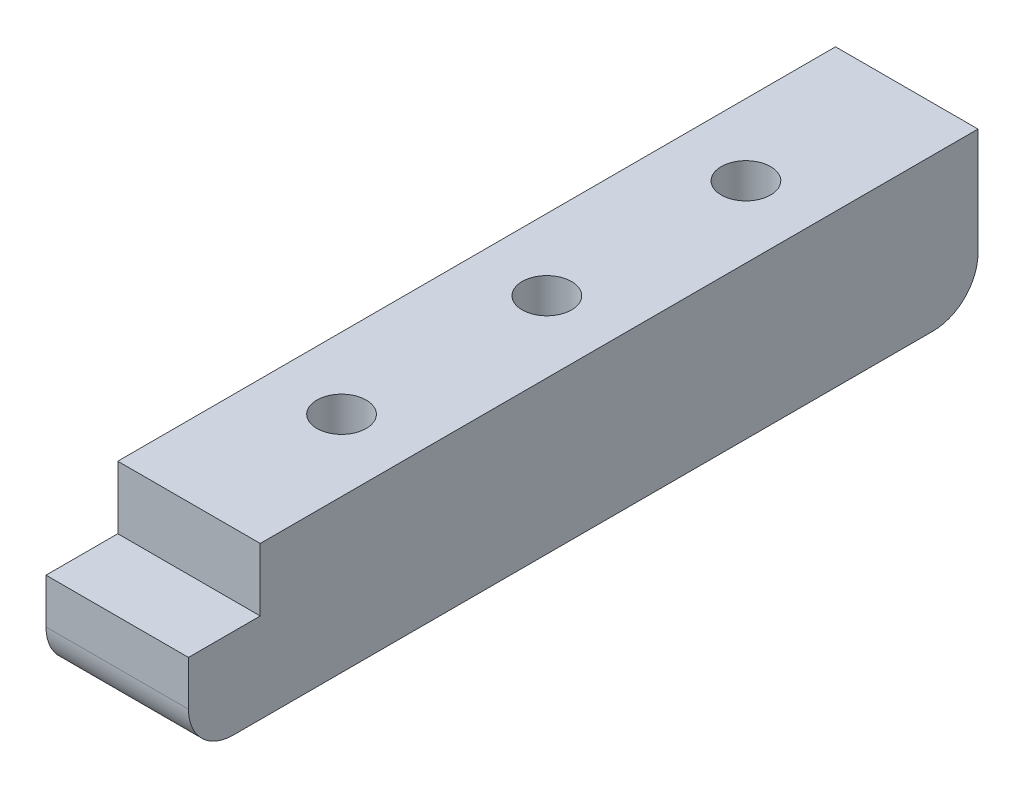
ISO-10303-21;
HEADER;
FILE_DESCRIPTION(('STEP AP214'),'2;1');
FILE_NAME('part.step','',(''),(''),'','','');
FILE_SCHEMA(('AUTOMOTIVE_DESIGN { 1 0 10303 214 1 1 1 1 }'));
ENDSEC;
DATA;
#1=APPLICATION_CONTEXT('core data for automotive mechanical design processes');
#2=APPLICATION_PROTOCOL_DEFINITION('international standard','automotive_design',2000,#1);
#3=PRODUCT_CONTEXT('',#1,'mechanical');
#4=PRODUCT('Part','Part','',(#3));
#5=PRODUCT_RELATED_PRODUCT_CATEGORY('part','',(#4));
#6=PRODUCT_DEFINITION_FORMATION('','',#4);
#7=PRODUCT_DEFINITION_CONTEXT('part definition',#1,'design');
#8=PRODUCT_DEFINITION('design','',#6,#7);
#9=PRODUCT_DEFINITION_SHAPE('','',#8);
#10=(LENGTH_UNIT() NAMED_UNIT(*) SI_UNIT(.MILLI.,.METRE.));
#11=(NAMED_UNIT(*) PLANE_ANGLE_UNIT() SI_UNIT($,.RADIAN.));
#12=(NAMED_UNIT(*) SI_UNIT($,.STERADIAN.) SOLID_ANGLE_UNIT());
#13=UNCERTAINTY_MEASURE_WITH_UNIT(LENGTH_MEASURE(1.E-05),#10,'distance_accuracy_value','');
#14=(GEOMETRIC_REPRESENTATION_CONTEXT(3) GLOBAL_UNCERTAINTY_ASSIGNED_CONTEXT((#13)) GLOBAL_UNIT_ASSIGNED_CONTEXT((#10,
#11,#12)) REPRESENTATION_CONTEXT('',''));
#15=CARTESIAN_POINT('',(0.,0.,0.));
#16=DIRECTION('',(0.,0.,1.));
#17=DIRECTION('',(1.,0.,0.));
#18=AXIS2_PLACEMENT_3D('',#15,#16,#17);
#19=CARTESIAN_POINT('',(7.94,-8.5,-63.));
#20=DIRECTION('',(0.,0.,1.));
#21=DIRECTION('',(1.,0.,0.));
#22=AXIS2_PLACEMENT_3D('',#19,#20,#21);
#23=PLANE('',#22);
#24=DIRECTION('',(0.,1.,0.));
#25=VECTOR('',#24,1.);
#26=CARTESIAN_POINT('',(7.94,-8.5,-63.));
#27=LINE('',#26,#25);
#28=CARTESIAN_POINT('',(7.94,-3.5,-63.));
#29=VERTEX_POINT('',#28);
#30=CARTESIAN_POINT('',(7.94,8.5,-63.));
#31=VERTEX_POINT('',#30);
#32=EDGE_CURVE('E102',#29,#31,#27,.T.);
#33=ORIENTED_EDGE('',*,*,#32,.F.);
#34=DIRECTION('',(-1.,0.,0.));
#35=VECTOR('',#34,1.);
#36=CARTESIAN_POINT('',(7.94,-3.5,-63.));
#37=LINE('',#36,#35);
#38=CARTESIAN_POINT('',(-7.94,-3.5,-63.));
#39=VERTEX_POINT('',#38);
#40=EDGE_CURVE('E11',#29,#39,#37,.T.);
#41=ORIENTED_EDGE('',*,*,#40,.T.);
#42=DIRECTION('',(0.,1.,0.));
#43=VECTOR('',#42,1.);
#44=CARTESIAN_POINT('',(-7.94,-8.5,-63.));
#45=LINE('',#44,#43);
#46=CARTESIAN_POINT('',(-7.94,8.5,-63.));
#47=VERTEX_POINT('',#46);
#48=EDGE_CURVE('E122',#39,#47,#45,.T.);
#49=ORIENTED_EDGE('',*,*,#48,.T.);
#50=DIRECTION('',(-1.,0.,0.));
#51=VECTOR('',#50,1.);
#52=CARTESIAN_POINT('',(7.94,8.5,-63.));
#53=LINE('',#52,#51);
#54=EDGE_CURVE('E115',#31,#47,#53,.T.);
#55=ORIENTED_EDGE('',*,*,#54,.F.);
#56=EDGE_LOOP('',(#33,#41,#49,#55));
#57=FACE_BOUND('',#56,.T.);
#58=ADVANCED_FACE('F35',(#57),#23,.F.);
#59=CARTESIAN_POINT('',(7.94,8.5,17.));
#60=DIRECTION('',(0.,-1.,0.));
#61=DIRECTION('',(0.,0.,-1.));
#62=AXIS2_PLACEMENT_3D('',#59,#60,#61);
#63=PLANE('',#62);
#64=CARTESIAN_POINT('',(0.,8.5,-22.887127338322));
#65=DIRECTION('',(0.,-1.,0.));
#66=DIRECTION('',(0.,0.,-1.));
#67=AXIS2_PLACEMENT_3D('',#64,#65,#66);
#68=CIRCLE('',#67,2.75);
#69=CARTESIAN_POINT('',(0.,8.5,-25.637127338322));
#70=VERTEX_POINT('',#69);
#71=EDGE_CURVE('E369',#70,#70,#68,.T.);
#72=ORIENTED_EDGE('',*,*,#71,.T.);
#73=EDGE_LOOP('',(#72));
#74=FACE_BOUND('',#73,.T.);
#75=CARTESIAN_POINT('',(0.,8.5,-45.0726046259848));
#76=DIRECTION('',(0.,-1.,0.));
#77=DIRECTION('',(0.,0.,-1.));
#78=AXIS2_PLACEMENT_3D('',#75,#76,#77);
#79=CIRCLE('',#78,2.75);
#80=CARTESIAN_POINT('',(0.,8.5,-47.8226046259848));
#81=VERTEX_POINT('',#80);
#82=EDGE_CURVE('E39',#81,#81,#79,.T.);
#83=ORIENTED_EDGE('',*,*,#82,.T.);
#84=EDGE_LOOP('',(#83));
#85=FACE_BOUND('',#84,.T.);
#86=CARTESIAN_POINT('',(0.,8.5,0.));
#87=DIRECTION('',(0.,-1.,0.));
#88=DIRECTION('',(0.,0.,-1.));
#89=AXIS2_PLACEMENT_3D('',#86,#87,#88);
#90=CIRCLE('',#89,2.75);
#91=CARTESIAN_POINT('',(0.,8.5,-2.74999999999999));
#92=VERTEX_POINT('',#91);
#93=EDGE_CURVE('E140',#92,#92,#90,.T.);
#94=ORIENTED_EDGE('',*,*,#93,.T.);
#95=EDGE_LOOP('',(#94));
#96=FACE_BOUND('',#95,.T.);
#97=DIRECTION('',(0.,0.,1.));
#98=VECTOR('',#97,1.);
#99=CARTESIAN_POINT('',(-7.94,8.5,17.));
#100=LINE('',#99,#98);
#101=CARTESIAN_POINT('',(-7.94,8.5,17.));
#102=VERTEX_POINT('',#101);
#103=EDGE_CURVE('E145',#47,#102,#100,.T.);
#104=ORIENTED_EDGE('',*,*,#103,.T.);
#105=DIRECTION('',(-1.,0.,0.));
#106=VECTOR('',#105,1.);
#107=CARTESIAN_POINT('',(7.94,8.5,17.));
#108=LINE('',#107,#106);
#109=CARTESIAN_POINT('',(7.94,8.5,17.));
#110=VERTEX_POINT('',#109);
#111=EDGE_CURVE('E117',#110,#102,#108,.T.);
#112=ORIENTED_EDGE('',*,*,#111,.F.);
#113=DIRECTION('',(0.,0.,1.));
#114=VECTOR('',#113,1.);
#115=CARTESIAN_POINT('',(7.94,8.5,17.));
#116=LINE('',#115,#114);
#117=EDGE_CURVE('E105',#31,#110,#116,.T.);
#118=ORIENTED_EDGE('',*,*,#117,.F.);
#119=ORIENTED_EDGE('',*,*,#54,.T.);
#120=EDGE_LOOP('',(#104,#112,#118,#119));
#121=FACE_BOUND('',#120,.T.);
#122=ADVANCED_FACE('F114',(#74,#85,#96,#121),#63,.F.);
#123=CARTESIAN_POINT('',(7.94,1.49999999999998,17.));
#124=DIRECTION('',(0.,0.,-1.));
#125=DIRECTION('',(-1.,0.,0.));
#126=AXIS2_PLACEMENT_3D('',#123,#124,#125);
#127=PLANE('',#126);
#128=DIRECTION('',(0.,-1.,0.));
#129=VECTOR('',#128,1.);
#130=CARTESIAN_POINT('',(-7.94,1.49999999999998,17.));
#131=LINE('',#130,#129);
#132=CARTESIAN_POINT('',(-7.94,1.49999999999998,17.));
#133=VERTEX_POINT('',#132);
#134=EDGE_CURVE('E166',#102,#133,#131,.T.);
#135=ORIENTED_EDGE('',*,*,#134,.T.);
#136=DIRECTION('',(-1.,0.,0.));
#137=VECTOR('',#136,1.);
#138=CARTESIAN_POINT('',(7.94,1.49999999999998,17.));
#139=LINE('',#138,#137);
#140=CARTESIAN_POINT('',(7.94,1.49999999999998,17.));
#141=VERTEX_POINT('',#140);
#142=EDGE_CURVE('E128',#141,#133,#139,.T.);
#143=ORIENTED_EDGE('',*,*,#142,.F.);
#144=DIRECTION('',(0.,-1.,0.));
#145=VECTOR('',#144,1.);
#146=CARTESIAN_POINT('',(7.94,1.49999999999998,17.));
#147=LINE('',#146,#145);
#148=EDGE_CURVE('E119',#110,#141,#147,.T.);
#149=ORIENTED_EDGE('',*,*,#148,.F.);
#150=ORIENTED_EDGE('',*,*,#111,.T.);
#151=EDGE_LOOP('',(#135,#143,#149,#150));
#152=FACE_BOUND('',#151,.T.);
#153=ADVANCED_FACE('F198',(#152),#127,.F.);
#154=CARTESIAN_POINT('',(7.94,1.49999999999998,17.));
#155=DIRECTION('',(0.,-1.,0.));
#156=DIRECTION('',(0.,0.,-1.));
#157=AXIS2_PLACEMENT_3D('',#154,#155,#156);
#158=PLANE('',#157);
#159=DIRECTION('',(0.,0.,1.));
#160=VECTOR('',#159,1.);
#161=CARTESIAN_POINT('',(-7.94,1.49999999999998,17.));
#162=LINE('',#161,#160);
#163=CARTESIAN_POINT('',(-7.94,1.49999999999998,25.));
#164=VERTEX_POINT('',#163);
#165=EDGE_CURVE('E168',#133,#164,#162,.T.);
#166=ORIENTED_EDGE('',*,*,#165,.T.);
#167=DIRECTION('',(-1.,0.,0.));
#168=VECTOR('',#167,1.);
#169=CARTESIAN_POINT('',(7.94,1.49999999999998,25.));
#170=LINE('',#169,#168);
#171=CARTESIAN_POINT('',(7.94,1.49999999999998,25.));
#172=VERTEX_POINT('',#171);
#173=EDGE_CURVE('E163',#172,#164,#170,.T.);
#174=ORIENTED_EDGE('',*,*,#173,.F.);
#175=DIRECTION('',(0.,0.,1.));
#176=VECTOR('',#175,1.);
#177=CARTESIAN_POINT('',(7.94,1.49999999999998,17.));
#178=LINE('',#177,#176);
#179=EDGE_CURVE('E158',#141,#172,#178,.T.);
#180=ORIENTED_EDGE('',*,*,#179,.F.);
#181=ORIENTED_EDGE('',*,*,#142,.T.);
#182=EDGE_LOOP('',(#166,#174,#180,#181));
#183=FACE_BOUND('',#182,.T.);
#184=ADVANCED_FACE('F180',(#183),#158,.F.);
#185=CARTESIAN_POINT('',(7.94,-8.50000000000001,25.));
#186=DIRECTION('',(0.,0.,-1.));
#187=DIRECTION('',(-1.,0.,0.));
#188=AXIS2_PLACEMENT_3D('',#185,#186,#187);
#189=PLANE('',#188);
#190=DIRECTION('',(0.,-1.,0.));
#191=VECTOR('',#190,1.);
#192=CARTESIAN_POINT('',(-7.94,-8.50000000000001,25.));
#193=LINE('',#192,#191);
#194=CARTESIAN_POINT('',(-7.94,-3.5,25.));
#195=VERTEX_POINT('',#194);
#196=EDGE_CURVE('E170',#164,#195,#193,.T.);
#197=ORIENTED_EDGE('',*,*,#196,.T.);
#198=DIRECTION('',(-1.,0.,0.));
#199=VECTOR('',#198,1.);
#200=CARTESIAN_POINT('',(7.94,-3.5,25.));
#201=LINE('',#200,#199);
#202=CARTESIAN_POINT('',(7.94,-3.5,25.));
#203=VERTEX_POINT('',#202);
#204=EDGE_CURVE('E60',#195,#203,#201,.F.);
#205=ORIENTED_EDGE('',*,*,#204,.T.);
#206=DIRECTION('',(0.,-1.,0.));
#207=VECTOR('',#206,1.);
#208=CARTESIAN_POINT('',(7.94,-8.50000000000001,25.));
#209=LINE('',#208,#207);
#210=EDGE_CURVE('E160',#172,#203,#209,.T.);
#211=ORIENTED_EDGE('',*,*,#210,.F.);
#212=ORIENTED_EDGE('',*,*,#173,.T.);
#213=EDGE_LOOP('',(#197,#205,#211,#212));
#214=FACE_BOUND('',#213,.T.);
#215=ADVANCED_FACE('F188',(#214),#189,.F.);
#216=CARTESIAN_POINT('',(7.94,-8.5,17.));
#217=DIRECTION('',(0.,1.,0.));
#218=DIRECTION('',(0.,0.,1.));
#219=AXIS2_PLACEMENT_3D('',#216,#217,#218);
#220=PLANE('',#219);
#221=CARTESIAN_POINT('',(0.,-8.5,-22.887127338322));
#222=DIRECTION('',(0.,-1.,0.));
#223=DIRECTION('',(0.,0.,-1.));
#224=AXIS2_PLACEMENT_3D('',#221,#222,#223);
#225=CIRCLE('',#224,5.6);
#226=CARTESIAN_POINT('',(0.,-8.5,-28.487127338322));
#227=VERTEX_POINT('',#226);
#228=EDGE_CURVE('E367',#227,#227,#225,.T.);
#229=ORIENTED_EDGE('',*,*,#228,.F.);
#230=EDGE_LOOP('',(#229));
#231=FACE_BOUND('',#230,.T.);
#232=CARTESIAN_POINT('',(0.,-8.5,-45.0726046259848));
#233=DIRECTION('',(0.,-1.,0.));
#234=DIRECTION('',(0.,0.,-1.));
#235=AXIS2_PLACEMENT_3D('',#232,#233,#234);
#236=CIRCLE('',#235,5.6);
#237=CARTESIAN_POINT('',(0.,-8.5,-50.6726046259848));
#238=VERTEX_POINT('',#237);
#239=EDGE_CURVE('E374',#238,#238,#236,.T.);
#240=ORIENTED_EDGE('',*,*,#239,.F.);
#241=EDGE_LOOP('',(#240));
#242=FACE_BOUND('',#241,.T.);
#243=CARTESIAN_POINT('',(0.,-8.5,0.));
#244=DIRECTION('',(0.,-1.,0.));
#245=DIRECTION('',(0.,0.,-1.));
#246=AXIS2_PLACEMENT_3D('',#243,#244,#245);
#247=CIRCLE('',#246,5.6);
#248=CARTESIAN_POINT('',(0.,-8.5,-5.6));
#249=VERTEX_POINT('',#248);
#250=EDGE_CURVE('E153',#249,#249,#247,.T.);
#251=ORIENTED_EDGE('',*,*,#250,.F.);
#252=EDGE_LOOP('',(#251));
#253=FACE_BOUND('',#252,.T.);
#254=DIRECTION('',(0.,0.,-1.));
#255=VECTOR('',#254,1.);
#256=CARTESIAN_POINT('',(7.94,-8.5,17.));
#257=LINE('',#256,#255);
#258=CARTESIAN_POINT('',(7.94,-8.5,20.));
#259=VERTEX_POINT('',#258);
#260=CARTESIAN_POINT('',(7.94,-8.49999999999995,-58.));
#261=VERTEX_POINT('',#260);
#262=EDGE_CURVE('E162',#259,#261,#257,.T.);
#263=ORIENTED_EDGE('',*,*,#262,.F.);
#264=DIRECTION('',(-1.,0.,0.));
#265=VECTOR('',#264,1.);
#266=CARTESIAN_POINT('',(7.94,-8.5,20.));
#267=LINE('',#266,#265);
#268=CARTESIAN_POINT('',(-7.94,-8.5,20.));
#269=VERTEX_POINT('',#268);
#270=EDGE_CURVE('E126',#259,#269,#267,.T.);
#271=ORIENTED_EDGE('',*,*,#270,.T.);
#272=DIRECTION('',(0.,0.,-1.));
#273=VECTOR('',#272,1.);
#274=CARTESIAN_POINT('',(-7.94,-8.5,17.));
#275=LINE('',#274,#273);
#276=CARTESIAN_POINT('',(-7.94,-8.5,-58.));
#277=VERTEX_POINT('',#276);
#278=EDGE_CURVE('E110',#269,#277,#275,.T.);
#279=ORIENTED_EDGE('',*,*,#278,.T.);
#280=DIRECTION('',(-1.,0.,0.));
#281=VECTOR('',#280,1.);
#282=CARTESIAN_POINT('',(7.94,-8.5,-58.));
#283=LINE('',#282,#281);
#284=EDGE_CURVE('E124',#277,#261,#283,.F.);
#285=ORIENTED_EDGE('',*,*,#284,.T.);
#286=EDGE_LOOP('',(#263,#271,#279,#285));
#287=FACE_BOUND('',#286,.T.);
#288=ADVANCED_FACE('F195',(#231,#242,#253,#287),#220,.F.);
#289=CARTESIAN_POINT('',(7.94,0.,0.));
#290=DIRECTION('',(-1.,0.,0.));
#291=DIRECTION('',(0.,0.,1.));
#292=AXIS2_PLACEMENT_3D('',#289,#290,#291);
#293=PLANE('',#292);
#294=ORIENTED_EDGE('',*,*,#210,.T.);
#295=CARTESIAN_POINT('',(7.94,-3.5,20.));
#296=DIRECTION('',(-1.,0.,0.));
#297=DIRECTION('',(0.,0.,1.));
#298=AXIS2_PLACEMENT_3D('',#295,#296,#297);
#299=CIRCLE('',#298,5.);
#300=EDGE_CURVE('E44',#203,#259,#299,.F.);
#301=ORIENTED_EDGE('',*,*,#300,.T.);
#302=ORIENTED_EDGE('',*,*,#262,.T.);
#303=CARTESIAN_POINT('',(7.94,-3.5,-58.));
#304=DIRECTION('',(-1.,0.,0.));
#305=DIRECTION('',(0.,0.,1.));
#306=AXIS2_PLACEMENT_3D('',#303,#304,#305);
#307=CIRCLE('',#306,5.);
#308=EDGE_CURVE('E52',#261,#29,#307,.F.);
#309=ORIENTED_EDGE('',*,*,#308,.T.);
#310=ORIENTED_EDGE('',*,*,#32,.T.);
#311=ORIENTED_EDGE('',*,*,#117,.T.);
#312=ORIENTED_EDGE('',*,*,#148,.T.);
#313=ORIENTED_EDGE('',*,*,#179,.T.);
#314=EDGE_LOOP('',(#294,#301,#302,#309,#310,#311,#312,#313));
#315=FACE_BOUND('',#314,.T.);
#316=ADVANCED_FACE('F104',(#315),#293,.F.);
#317=CARTESIAN_POINT('',(-7.94,0.,0.));
#318=DIRECTION('',(-1.,0.,0.));
#319=DIRECTION('',(0.,0.,1.));
#320=AXIS2_PLACEMENT_3D('',#317,#318,#319);
#321=PLANE('',#320);
#322=ORIENTED_EDGE('',*,*,#278,.F.);
#323=CARTESIAN_POINT('',(-7.94,-3.5,20.));
#324=DIRECTION('',(-1.,0.,0.));
#325=DIRECTION('',(0.,0.,1.));
#326=AXIS2_PLACEMENT_3D('',#323,#324,#325);
#327=CIRCLE('',#326,5.);
#328=EDGE_CURVE('E136',#269,#195,#327,.T.);
#329=ORIENTED_EDGE('',*,*,#328,.T.);
#330=ORIENTED_EDGE('',*,*,#196,.F.);
#331=ORIENTED_EDGE('',*,*,#165,.F.);
#332=ORIENTED_EDGE('',*,*,#134,.F.);
#333=ORIENTED_EDGE('',*,*,#103,.F.);
#334=ORIENTED_EDGE('',*,*,#48,.F.);
#335=CARTESIAN_POINT('',(-7.94,-3.5,-58.));
#336=DIRECTION('',(-1.,0.,0.));
#337=DIRECTION('',(0.,0.,1.));
#338=AXIS2_PLACEMENT_3D('',#335,#336,#337);
#339=CIRCLE('',#338,5.);
#340=EDGE_CURVE('E134',#39,#277,#339,.T.);
#341=ORIENTED_EDGE('',*,*,#340,.T.);
#342=EDGE_LOOP('',(#322,#329,#330,#331,#332,#333,#334,#341));
#343=FACE_BOUND('',#342,.T.);
#344=ADVANCED_FACE('F187',(#343),#321,.T.);
#345=CARTESIAN_POINT('',(7.94,-3.5,20.));
#346=DIRECTION('',(-1.,0.,0.));
#347=DIRECTION('',(0.,0.,1.));
#348=AXIS2_PLACEMENT_3D('',#345,#346,#347);
#349=CYLINDRICAL_SURFACE('',#348,5.);
#350=ORIENTED_EDGE('',*,*,#300,.F.);
#351=ORIENTED_EDGE('',*,*,#204,.F.);
#352=ORIENTED_EDGE('',*,*,#328,.F.);
#353=ORIENTED_EDGE('',*,*,#270,.F.);
#354=EDGE_LOOP('',(#350,#351,#352,#353));
#355=FACE_BOUND('',#354,.T.);
#356=ADVANCED_FACE('F191',(#355),#349,.T.);
#357=CARTESIAN_POINT('',(7.94,-3.5,-58.));
#358=DIRECTION('',(-1.,0.,0.));
#359=DIRECTION('',(0.,0.,1.));
#360=AXIS2_PLACEMENT_3D('',#357,#358,#359);
#361=CYLINDRICAL_SURFACE('',#360,5.);
#362=ORIENTED_EDGE('',*,*,#308,.F.);
#363=ORIENTED_EDGE('',*,*,#284,.F.);
#364=ORIENTED_EDGE('',*,*,#340,.F.);
#365=ORIENTED_EDGE('',*,*,#40,.F.);
#366=EDGE_LOOP('',(#362,#363,#364,#365));
#367=FACE_BOUND('',#366,.T.);
#368=ADVANCED_FACE('F37',(#367),#361,.T.);
#369=CARTESIAN_POINT('',(0.,-8.5,0.));
#370=DIRECTION('',(0.,-1.,0.));
#371=DIRECTION('',(0.,0.,-1.));
#372=AXIS2_PLACEMENT_3D('',#369,#370,#371);
#373=CYLINDRICAL_SURFACE('',#372,2.75);
#374=CARTESIAN_POINT('',(0.,-5.15,0.));
#375=DIRECTION('',(0.,-1.,0.));
#376=DIRECTION('',(0.,0.,-1.));
#377=AXIS2_PLACEMENT_3D('',#374,#375,#376);
#378=CIRCLE('',#377,2.75);
#379=CARTESIAN_POINT('',(0.,-5.15,-2.75));
#380=VERTEX_POINT('',#379);
#381=EDGE_CURVE('E142',#380,#380,#378,.T.);
#382=ORIENTED_EDGE('',*,*,#381,.T.);
#383=EDGE_LOOP('',(#382));
#384=FACE_BOUND('',#383,.T.);
#385=ORIENTED_EDGE('',*,*,#93,.F.);
#386=EDGE_LOOP('',(#385));
#387=FACE_BOUND('',#386,.T.);
#388=ADVANCED_FACE('F217',(#384,#387),#373,.F.);
#389=CARTESIAN_POINT('',(0.,-8.,0.));
#390=DIRECTION('',(0.,-1.,0.));
#391=DIRECTION('',(0.,0.,-1.));
#392=AXIS2_PLACEMENT_3D('',#389,#390,#391);
#393=CONICAL_SURFACE('',#392,5.6,0.785398163397449);
#394=ORIENTED_EDGE('',*,*,#381,.F.);
#395=EDGE_LOOP('',(#394));
#396=FACE_BOUND('',#395,.T.);
#397=CARTESIAN_POINT('',(0.,-8.,0.));
#398=DIRECTION('',(0.,-1.,0.));
#399=DIRECTION('',(0.,0.,-1.));
#400=AXIS2_PLACEMENT_3D('',#397,#398,#399);
#401=CIRCLE('',#400,5.6);
#402=CARTESIAN_POINT('',(0.,-8.,-5.6));
#403=VERTEX_POINT('',#402);
#404=EDGE_CURVE('E148',#403,#403,#401,.T.);
#405=ORIENTED_EDGE('',*,*,#404,.T.);
#406=EDGE_LOOP('',(#405));
#407=FACE_BOUND('',#406,.T.);
#408=ADVANCED_FACE('F266',(#396,#407),#393,.F.);
#409=CARTESIAN_POINT('',(0.,-8.5,0.));
#410=DIRECTION('',(0.,-1.,0.));
#411=DIRECTION('',(0.,0.,-1.));
#412=AXIS2_PLACEMENT_3D('',#409,#410,#411);
#413=CYLINDRICAL_SURFACE('',#412,5.6);
#414=ORIENTED_EDGE('',*,*,#404,.F.);
#415=EDGE_LOOP('',(#414));
#416=FACE_BOUND('',#415,.T.);
#417=ORIENTED_EDGE('',*,*,#250,.T.);
#418=EDGE_LOOP('',(#417));
#419=FACE_BOUND('',#418,.T.);
#420=ADVANCED_FACE('F274',(#416,#419),#413,.F.);
#421=CARTESIAN_POINT('',(0.,-8.5,-45.0726046259848));
#422=DIRECTION('',(0.,-1.,0.));
#423=DIRECTION('',(0.,0.,-1.));
#424=AXIS2_PLACEMENT_3D('',#421,#422,#423);
#425=CYLINDRICAL_SURFACE('',#424,2.75);
#426=CARTESIAN_POINT('',(0.,-5.15,-45.0726046259848));
#427=DIRECTION('',(0.,-1.,0.));
#428=DIRECTION('',(0.,0.,-1.));
#429=AXIS2_PLACEMENT_3D('',#426,#427,#428);
#430=CIRCLE('',#429,2.75);
#431=CARTESIAN_POINT('',(0.,-5.15,-47.8226046259848));
#432=VERTEX_POINT('',#431);
#433=EDGE_CURVE('E380',#432,#432,#430,.T.);
#434=ORIENTED_EDGE('',*,*,#433,.T.);
#435=EDGE_LOOP('',(#434));
#436=FACE_BOUND('',#435,.T.);
#437=ORIENTED_EDGE('',*,*,#82,.F.);
#438=EDGE_LOOP('',(#437));
#439=FACE_BOUND('',#438,.T.);
#440=ADVANCED_FACE('F284',(#436,#439),#425,.F.);
#441=CARTESIAN_POINT('',(0.,-8.,-45.0726046259848));
#442=DIRECTION('',(0.,-1.,0.));
#443=DIRECTION('',(0.,0.,-1.));
#444=AXIS2_PLACEMENT_3D('',#441,#442,#443);
#445=CONICAL_SURFACE('',#444,5.6,0.785398163397449);
#446=ORIENTED_EDGE('',*,*,#433,.F.);
#447=EDGE_LOOP('',(#446));
#448=FACE_BOUND('',#447,.T.);
#449=CARTESIAN_POINT('',(0.,-8.,-45.0726046259848));
#450=DIRECTION('',(0.,-1.,0.));
#451=DIRECTION('',(0.,0.,-1.));
#452=AXIS2_PLACEMENT_3D('',#449,#450,#451);
#453=CIRCLE('',#452,5.6);
#454=CARTESIAN_POINT('',(0.,-8.,-50.6726046259848));
#455=VERTEX_POINT('',#454);
#456=EDGE_CURVE('E377',#455,#455,#453,.T.);
#457=ORIENTED_EDGE('',*,*,#456,.T.);
#458=EDGE_LOOP('',(#457));
#459=FACE_BOUND('',#458,.T.);
#460=ADVANCED_FACE('F294',(#448,#459),#445,.F.);
#461=CARTESIAN_POINT('',(0.,-8.5,-45.0726046259848));
#462=DIRECTION('',(0.,-1.,0.));
#463=DIRECTION('',(0.,0.,-1.));
#464=AXIS2_PLACEMENT_3D('',#461,#462,#463);
#465=CYLINDRICAL_SURFACE('',#464,5.6);
#466=ORIENTED_EDGE('',*,*,#456,.F.);
#467=EDGE_LOOP('',(#466));
#468=FACE_BOUND('',#467,.T.);
#469=ORIENTED_EDGE('',*,*,#239,.T.);
#470=EDGE_LOOP('',(#469));
#471=FACE_BOUND('',#470,.T.);
#472=ADVANCED_FACE('F304',(#468,#471),#465,.F.);
#473=CARTESIAN_POINT('',(0.,-8.5,-22.887127338322));
#474=DIRECTION('',(0.,-1.,0.));
#475=DIRECTION('',(0.,0.,-1.));
#476=AXIS2_PLACEMENT_3D('',#473,#474,#475);
#477=CYLINDRICAL_SURFACE('',#476,2.75);
#478=ORIENTED_EDGE('',*,*,#71,.F.);
#479=EDGE_LOOP('',(#478));
#480=FACE_BOUND('',#479,.T.);
#481=CARTESIAN_POINT('',(0.,-5.65,-22.887127338322));
#482=DIRECTION('',(0.,-1.,0.));
#483=DIRECTION('',(0.,0.,-1.));
#484=AXIS2_PLACEMENT_3D('',#481,#482,#483);
#485=CIRCLE('',#484,2.75);
#486=CARTESIAN_POINT('',(0.,-5.65,-25.637127338322));
#487=VERTEX_POINT('',#486);
#488=EDGE_CURVE('E364',#487,#487,#485,.T.);
#489=ORIENTED_EDGE('',*,*,#488,.T.);
#490=EDGE_LOOP('',(#489));
#491=FACE_BOUND('',#490,.T.);
#492=ADVANCED_FACE('F313',(#480,#491),#477,.F.);
#493=CARTESIAN_POINT('',(0.,-8.5,-22.887127338322));
#494=DIRECTION('',(0.,-1.,0.));
#495=DIRECTION('',(0.,0.,-1.));
#496=AXIS2_PLACEMENT_3D('',#493,#494,#495);
#497=CONICAL_SURFACE('',#496,5.6,0.785398163397449);
#498=ORIENTED_EDGE('',*,*,#488,.F.);
#499=EDGE_LOOP('',(#498));
#500=FACE_BOUND('',#499,.T.);
#501=ORIENTED_EDGE('',*,*,#228,.T.);
#502=EDGE_LOOP('',(#501));
#503=FACE_BOUND('',#502,.T.);
#504=ADVANCED_FACE('F347',(#500,#503),#497,.F.);
#505=CLOSED_SHELL('',(#58,#122,#153,#184,#215,#288,#316,#344,#356,#368,#388,#408,#420,#440,#460,
#472,#492,#504));
#506=MANIFOLD_SOLID_BREP('B2',#505);
#507=ADVANCED_BREP_SHAPE_REPRESENTATION('',(#18,#506),#14);
#508=SHAPE_DEFINITION_REPRESENTATION(#9,#507);
ENDSEC;
END-ISO-10303-21;
